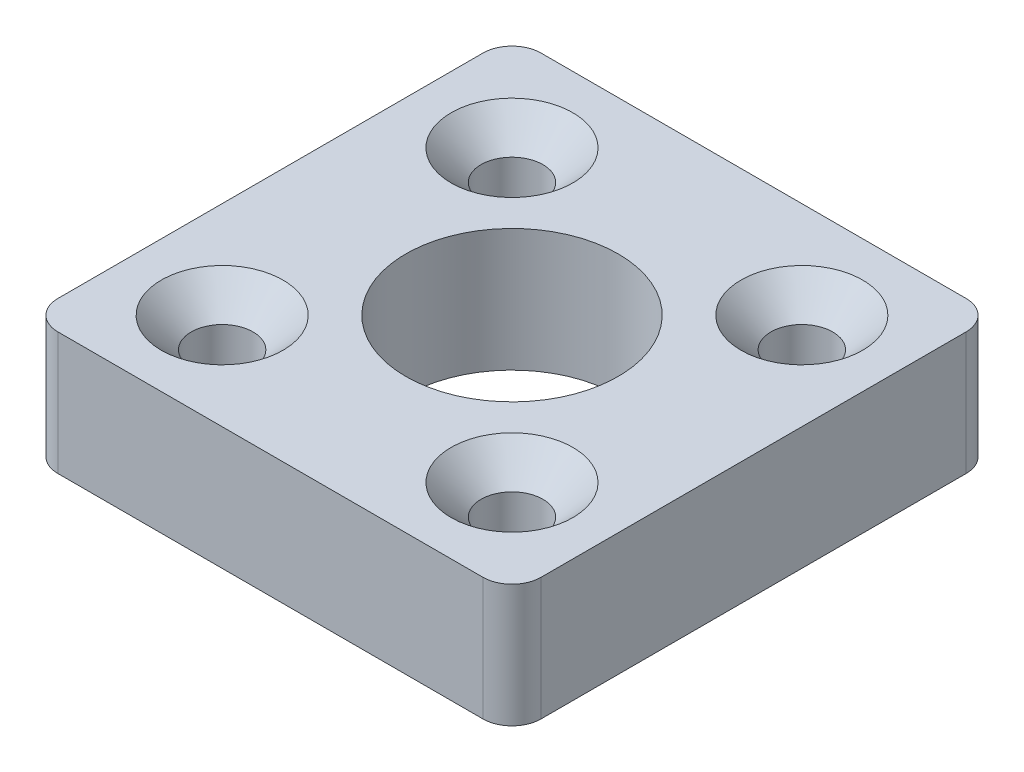
ISO-10303-21;
HEADER;
FILE_DESCRIPTION(('STEP AP214'),'2;1');
FILE_NAME('part.step','',(''),(''),'','','');
FILE_SCHEMA(('AUTOMOTIVE_DESIGN { 1 0 10303 214 1 1 1 1 }'));
ENDSEC;
DATA;
#1=APPLICATION_CONTEXT('core data for automotive mechanical design processes');
#2=APPLICATION_PROTOCOL_DEFINITION('international standard','automotive_design',2000,#1);
#3=PRODUCT_CONTEXT('',#1,'mechanical');
#4=PRODUCT('Part','Part','',(#3));
#5=PRODUCT_RELATED_PRODUCT_CATEGORY('part','',(#4));
#6=PRODUCT_DEFINITION_FORMATION('','',#4);
#7=PRODUCT_DEFINITION_CONTEXT('part definition',#1,'design');
#8=PRODUCT_DEFINITION('design','',#6,#7);
#9=PRODUCT_DEFINITION_SHAPE('','',#8);
#10=(LENGTH_UNIT() NAMED_UNIT(*) SI_UNIT(.MILLI.,.METRE.));
#11=(NAMED_UNIT(*) PLANE_ANGLE_UNIT() SI_UNIT($,.RADIAN.));
#12=(NAMED_UNIT(*) SI_UNIT($,.STERADIAN.) SOLID_ANGLE_UNIT());
#13=UNCERTAINTY_MEASURE_WITH_UNIT(LENGTH_MEASURE(1.E-05),#10,'distance_accuracy_value','');
#14=(GEOMETRIC_REPRESENTATION_CONTEXT(3) GLOBAL_UNCERTAINTY_ASSIGNED_CONTEXT((#13)) GLOBAL_UNIT_ASSIGNED_CONTEXT((#10,
#11,#12)) REPRESENTATION_CONTEXT('',''));
#15=CARTESIAN_POINT('',(0.,0.,0.));
#16=DIRECTION('',(0.,0.,1.));
#17=DIRECTION('',(1.,0.,0.));
#18=AXIS2_PLACEMENT_3D('',#15,#16,#17);
#19=CARTESIAN_POINT('',(-25.,-12.7,-25.));
#20=DIRECTION('',(-1.,0.,0.));
#21=DIRECTION('',(0.,0.,1.));
#22=AXIS2_PLACEMENT_3D('',#19,#20,#21);
#23=PLANE('',#22);
#24=DIRECTION('',(0.,0.,1.));
#25=VECTOR('',#24,1.);
#26=CARTESIAN_POINT('',(-25.,0.,-25.));
#27=LINE('',#26,#25);
#28=CARTESIAN_POINT('',(-25.,0.,-22.));
#29=VERTEX_POINT('',#28);
#30=CARTESIAN_POINT('',(-25.,0.,22.));
#31=VERTEX_POINT('',#30);
#32=EDGE_CURVE('E185',#29,#31,#27,.T.);
#33=ORIENTED_EDGE('',*,*,#32,.F.);
#34=DIRECTION('',(0.,1.,0.));
#35=VECTOR('',#34,1.);
#36=CARTESIAN_POINT('',(-25.,-12.7,-22.));
#37=LINE('',#36,#35);
#38=CARTESIAN_POINT('',(-25.,-12.7,-22.));
#39=VERTEX_POINT('',#38);
#40=EDGE_CURVE('E155',#29,#39,#37,.F.);
#41=ORIENTED_EDGE('',*,*,#40,.T.);
#42=DIRECTION('',(0.,0.,1.));
#43=VECTOR('',#42,1.);
#44=CARTESIAN_POINT('',(-25.,-12.7,-25.));
#45=LINE('',#44,#43);
#46=CARTESIAN_POINT('',(-25.,-12.7,22.));
#47=VERTEX_POINT('',#46);
#48=EDGE_CURVE('E129',#39,#47,#45,.T.);
#49=ORIENTED_EDGE('',*,*,#48,.T.);
#50=DIRECTION('',(0.,1.,0.));
#51=VECTOR('',#50,1.);
#52=CARTESIAN_POINT('',(-25.,-12.7,22.));
#53=LINE('',#52,#51);
#54=EDGE_CURVE('E151',#47,#31,#53,.T.);
#55=ORIENTED_EDGE('',*,*,#54,.T.);
#56=EDGE_LOOP('',(#33,#41,#49,#55));
#57=FACE_BOUND('',#56,.T.);
#58=ADVANCED_FACE('F39',(#57),#23,.T.);
#59=CARTESIAN_POINT('',(-25.,-12.7,-25.));
#60=DIRECTION('',(0.,0.,-1.));
#61=DIRECTION('',(-1.,0.,0.));
#62=AXIS2_PLACEMENT_3D('',#59,#60,#61);
#63=PLANE('',#62);
#64=DIRECTION('',(-1.,0.,0.));
#65=VECTOR('',#64,1.);
#66=CARTESIAN_POINT('',(-25.,-12.7,-25.));
#67=LINE('',#66,#65);
#68=CARTESIAN_POINT('',(22.,-12.7,-25.));
#69=VERTEX_POINT('',#68);
#70=CARTESIAN_POINT('',(-22.,-12.7,-25.));
#71=VERTEX_POINT('',#70);
#72=EDGE_CURVE('E135',#69,#71,#67,.T.);
#73=ORIENTED_EDGE('',*,*,#72,.T.);
#74=DIRECTION('',(0.,1.,0.));
#75=VECTOR('',#74,1.);
#76=CARTESIAN_POINT('',(-22.,-12.7,-25.));
#77=LINE('',#76,#75);
#78=CARTESIAN_POINT('',(-22.,0.,-25.));
#79=VERTEX_POINT('',#78);
#80=EDGE_CURVE('E127',#71,#79,#77,.T.);
#81=ORIENTED_EDGE('',*,*,#80,.T.);
#82=DIRECTION('',(-1.,0.,0.));
#83=VECTOR('',#82,1.);
#84=CARTESIAN_POINT('',(-25.,0.,-25.));
#85=LINE('',#84,#83);
#86=CARTESIAN_POINT('',(22.,0.,-25.));
#87=VERTEX_POINT('',#86);
#88=EDGE_CURVE('E109',#87,#79,#85,.T.);
#89=ORIENTED_EDGE('',*,*,#88,.F.);
#90=DIRECTION('',(0.,1.,0.));
#91=VECTOR('',#90,1.);
#92=CARTESIAN_POINT('',(22.,-12.7,-25.));
#93=LINE('',#92,#91);
#94=EDGE_CURVE('E124',#87,#69,#93,.F.);
#95=ORIENTED_EDGE('',*,*,#94,.T.);
#96=EDGE_LOOP('',(#73,#81,#89,#95));
#97=FACE_BOUND('',#96,.T.);
#98=ADVANCED_FACE('F123',(#97),#63,.T.);
#99=CARTESIAN_POINT('',(25.,-12.7,-25.));
#100=DIRECTION('',(1.,0.,0.));
#101=DIRECTION('',(0.,0.,-1.));
#102=AXIS2_PLACEMENT_3D('',#99,#100,#101);
#103=PLANE('',#102);
#104=DIRECTION('',(0.,0.,-1.));
#105=VECTOR('',#104,1.);
#106=CARTESIAN_POINT('',(25.,-12.7,-25.));
#107=LINE('',#106,#105);
#108=CARTESIAN_POINT('',(25.,-12.7,22.));
#109=VERTEX_POINT('',#108);
#110=CARTESIAN_POINT('',(25.,-12.7,-22.));
#111=VERTEX_POINT('',#110);
#112=EDGE_CURVE('E141',#109,#111,#107,.T.);
#113=ORIENTED_EDGE('',*,*,#112,.T.);
#114=DIRECTION('',(0.,1.,0.));
#115=VECTOR('',#114,1.);
#116=CARTESIAN_POINT('',(25.,-12.7,-22.));
#117=LINE('',#116,#115);
#118=CARTESIAN_POINT('',(25.,0.,-22.));
#119=VERTEX_POINT('',#118);
#120=EDGE_CURVE('E171',#111,#119,#117,.T.);
#121=ORIENTED_EDGE('',*,*,#120,.T.);
#122=DIRECTION('',(0.,0.,-1.));
#123=VECTOR('',#122,1.);
#124=CARTESIAN_POINT('',(25.,0.,-25.));
#125=LINE('',#124,#123);
#126=CARTESIAN_POINT('',(25.,0.,22.));
#127=VERTEX_POINT('',#126);
#128=EDGE_CURVE('E111',#127,#119,#125,.T.);
#129=ORIENTED_EDGE('',*,*,#128,.F.);
#130=DIRECTION('',(0.,1.,0.));
#131=VECTOR('',#130,1.);
#132=CARTESIAN_POINT('',(25.,-12.7,22.));
#133=LINE('',#132,#131);
#134=EDGE_CURVE('E168',#127,#109,#133,.F.);
#135=ORIENTED_EDGE('',*,*,#134,.T.);
#136=EDGE_LOOP('',(#113,#121,#129,#135));
#137=FACE_BOUND('',#136,.T.);
#138=ADVANCED_FACE('F176',(#137),#103,.T.);
#139=CARTESIAN_POINT('',(-25.,-12.7,25.));
#140=DIRECTION('',(0.,0.,1.));
#141=DIRECTION('',(1.,0.,0.));
#142=AXIS2_PLACEMENT_3D('',#139,#140,#141);
#143=PLANE('',#142);
#144=DIRECTION('',(1.,0.,0.));
#145=VECTOR('',#144,1.);
#146=CARTESIAN_POINT('',(-25.,-12.7,25.));
#147=LINE('',#146,#145);
#148=CARTESIAN_POINT('',(-22.,-12.7,25.));
#149=VERTEX_POINT('',#148);
#150=CARTESIAN_POINT('',(22.,-12.7,25.));
#151=VERTEX_POINT('',#150);
#152=EDGE_CURVE('E179',#149,#151,#147,.T.);
#153=ORIENTED_EDGE('',*,*,#152,.T.);
#154=DIRECTION('',(0.,1.,0.));
#155=VECTOR('',#154,1.);
#156=CARTESIAN_POINT('',(22.,-12.7,25.));
#157=LINE('',#156,#155);
#158=CARTESIAN_POINT('',(22.,0.,25.));
#159=VERTEX_POINT('',#158);
#160=EDGE_CURVE('E11',#151,#159,#157,.T.);
#161=ORIENTED_EDGE('',*,*,#160,.T.);
#162=DIRECTION('',(1.,0.,0.));
#163=VECTOR('',#162,1.);
#164=CARTESIAN_POINT('',(-25.,0.,25.));
#165=LINE('',#164,#163);
#166=CARTESIAN_POINT('',(-22.,0.,25.));
#167=VERTEX_POINT('',#166);
#168=EDGE_CURVE('E189',#167,#159,#165,.T.);
#169=ORIENTED_EDGE('',*,*,#168,.F.);
#170=DIRECTION('',(0.,1.,0.));
#171=VECTOR('',#170,1.);
#172=CARTESIAN_POINT('',(-22.,-12.7,25.));
#173=LINE('',#172,#171);
#174=EDGE_CURVE('E48',#167,#149,#173,.F.);
#175=ORIENTED_EDGE('',*,*,#174,.T.);
#176=EDGE_LOOP('',(#153,#161,#169,#175));
#177=FACE_BOUND('',#176,.T.);
#178=ADVANCED_FACE('F261',(#177),#143,.T.);
#179=CARTESIAN_POINT('',(0.,-12.7,0.));
#180=DIRECTION('',(0.,1.,0.));
#181=DIRECTION('',(0.,0.,1.));
#182=AXIS2_PLACEMENT_3D('',#179,#180,#181);
#183=PLANE('',#182);
#184=CARTESIAN_POINT('',(-15.,-12.7,15.));
#185=DIRECTION('',(0.,1.,0.));
#186=DIRECTION('',(0.,0.,1.));
#187=AXIS2_PLACEMENT_3D('',#184,#185,#186);
#188=CIRCLE('',#187,3.2);
#189=CARTESIAN_POINT('',(-15.,-12.7,18.2));
#190=VERTEX_POINT('',#189);
#191=EDGE_CURVE('E238',#190,#190,#188,.T.);
#192=ORIENTED_EDGE('',*,*,#191,.T.);
#193=EDGE_LOOP('',(#192));
#194=FACE_BOUND('',#193,.T.);
#195=CARTESIAN_POINT('',(15.,-12.7,15.));
#196=DIRECTION('',(0.,1.,0.));
#197=DIRECTION('',(0.,0.,1.));
#198=AXIS2_PLACEMENT_3D('',#195,#196,#197);
#199=CIRCLE('',#198,3.2);
#200=CARTESIAN_POINT('',(15.,-12.7,18.2));
#201=VERTEX_POINT('',#200);
#202=EDGE_CURVE('E226',#201,#201,#199,.T.);
#203=ORIENTED_EDGE('',*,*,#202,.T.);
#204=EDGE_LOOP('',(#203));
#205=FACE_BOUND('',#204,.T.);
#206=CARTESIAN_POINT('',(-15.,-12.7,-15.));
#207=DIRECTION('',(0.,1.,0.));
#208=DIRECTION('',(0.,0.,1.));
#209=AXIS2_PLACEMENT_3D('',#206,#207,#208);
#210=CIRCLE('',#209,3.2);
#211=CARTESIAN_POINT('',(-15.,-12.7,-11.8));
#212=VERTEX_POINT('',#211);
#213=EDGE_CURVE('E214',#212,#212,#210,.T.);
#214=ORIENTED_EDGE('',*,*,#213,.T.);
#215=EDGE_LOOP('',(#214));
#216=FACE_BOUND('',#215,.T.);
#217=CARTESIAN_POINT('',(15.,-12.7,-15.));
#218=DIRECTION('',(0.,1.,0.));
#219=DIRECTION('',(0.,0.,1.));
#220=AXIS2_PLACEMENT_3D('',#217,#218,#219);
#221=CIRCLE('',#220,3.2);
#222=CARTESIAN_POINT('',(15.,-12.7,-11.8));
#223=VERTEX_POINT('',#222);
#224=EDGE_CURVE('E202',#223,#223,#221,.T.);
#225=ORIENTED_EDGE('',*,*,#224,.T.);
#226=EDGE_LOOP('',(#225));
#227=FACE_BOUND('',#226,.T.);
#228=CARTESIAN_POINT('',(0.,-12.7,0.));
#229=DIRECTION('',(0.,1.,0.));
#230=DIRECTION('',(0.,0.,1.));
#231=AXIS2_PLACEMENT_3D('',#228,#229,#230);
#232=CIRCLE('',#231,10.993);
#233=CARTESIAN_POINT('',(0.,-12.7,10.993));
#234=VERTEX_POINT('',#233);
#235=EDGE_CURVE('E190',#234,#234,#232,.T.);
#236=ORIENTED_EDGE('',*,*,#235,.T.);
#237=EDGE_LOOP('',(#236));
#238=FACE_BOUND('',#237,.T.);
#239=ORIENTED_EDGE('',*,*,#48,.F.);
#240=CARTESIAN_POINT('',(-22.,-12.7,-22.));
#241=DIRECTION('',(0.,1.,0.));
#242=DIRECTION('',(0.,0.,1.));
#243=AXIS2_PLACEMENT_3D('',#240,#241,#242);
#244=CIRCLE('',#243,3.);
#245=EDGE_CURVE('E165',#39,#71,#244,.F.);
#246=ORIENTED_EDGE('',*,*,#245,.T.);
#247=ORIENTED_EDGE('',*,*,#72,.F.);
#248=CARTESIAN_POINT('',(22.,-12.7,-22.));
#249=DIRECTION('',(0.,1.,0.));
#250=DIRECTION('',(0.,0.,1.));
#251=AXIS2_PLACEMENT_3D('',#248,#249,#250);
#252=CIRCLE('',#251,3.);
#253=EDGE_CURVE('E133',#69,#111,#252,.F.);
#254=ORIENTED_EDGE('',*,*,#253,.T.);
#255=ORIENTED_EDGE('',*,*,#112,.F.);
#256=CARTESIAN_POINT('',(22.,-12.7,22.));
#257=DIRECTION('',(0.,1.,0.));
#258=DIRECTION('',(0.,0.,1.));
#259=AXIS2_PLACEMENT_3D('',#256,#257,#258);
#260=CIRCLE('',#259,3.);
#261=EDGE_CURVE('E55',#109,#151,#260,.F.);
#262=ORIENTED_EDGE('',*,*,#261,.T.);
#263=ORIENTED_EDGE('',*,*,#152,.F.);
#264=CARTESIAN_POINT('',(-22.,-12.7,22.));
#265=DIRECTION('',(0.,1.,0.));
#266=DIRECTION('',(0.,0.,1.));
#267=AXIS2_PLACEMENT_3D('',#264,#265,#266);
#268=CIRCLE('',#267,3.);
#269=EDGE_CURVE('E158',#149,#47,#268,.F.);
#270=ORIENTED_EDGE('',*,*,#269,.T.);
#271=EDGE_LOOP('',(#239,#246,#247,#254,#255,#262,#263,#270));
#272=FACE_BOUND('',#271,.T.);
#273=ADVANCED_FACE('F290',(#194,#205,#216,#227,#238,#272),#183,.F.);
#274=CARTESIAN_POINT('',(0.,0.,0.));
#275=DIRECTION('',(0.,1.,0.));
#276=DIRECTION('',(0.,0.,1.));
#277=AXIS2_PLACEMENT_3D('',#274,#275,#276);
#278=PLANE('',#277);
#279=CARTESIAN_POINT('',(-15.,0.,15.));
#280=DIRECTION('',(0.,1.,0.));
#281=DIRECTION('',(0.,0.,1.));
#282=AXIS2_PLACEMENT_3D('',#279,#280,#281);
#283=CIRCLE('',#282,6.3);
#284=CARTESIAN_POINT('',(-15.,0.,21.3));
#285=VERTEX_POINT('',#284);
#286=EDGE_CURVE('E246',#285,#285,#283,.T.);
#287=ORIENTED_EDGE('',*,*,#286,.F.);
#288=EDGE_LOOP('',(#287));
#289=FACE_BOUND('',#288,.T.);
#290=CARTESIAN_POINT('',(15.,0.,15.));
#291=DIRECTION('',(0.,1.,0.));
#292=DIRECTION('',(0.,0.,1.));
#293=AXIS2_PLACEMENT_3D('',#290,#291,#292);
#294=CIRCLE('',#293,6.3);
#295=CARTESIAN_POINT('',(15.,0.,21.3));
#296=VERTEX_POINT('',#295);
#297=EDGE_CURVE('E234',#296,#296,#294,.T.);
#298=ORIENTED_EDGE('',*,*,#297,.F.);
#299=EDGE_LOOP('',(#298));
#300=FACE_BOUND('',#299,.T.);
#301=CARTESIAN_POINT('',(-15.,0.,-15.));
#302=DIRECTION('',(0.,1.,0.));
#303=DIRECTION('',(0.,0.,1.));
#304=AXIS2_PLACEMENT_3D('',#301,#302,#303);
#305=CIRCLE('',#304,6.3);
#306=CARTESIAN_POINT('',(-15.,0.,-8.7));
#307=VERTEX_POINT('',#306);
#308=EDGE_CURVE('E222',#307,#307,#305,.T.);
#309=ORIENTED_EDGE('',*,*,#308,.F.);
#310=EDGE_LOOP('',(#309));
#311=FACE_BOUND('',#310,.T.);
#312=CARTESIAN_POINT('',(15.,0.,-15.));
#313=DIRECTION('',(0.,1.,0.));
#314=DIRECTION('',(0.,0.,1.));
#315=AXIS2_PLACEMENT_3D('',#312,#313,#314);
#316=CIRCLE('',#315,6.3);
#317=CARTESIAN_POINT('',(15.,0.,-8.7));
#318=VERTEX_POINT('',#317);
#319=EDGE_CURVE('E210',#318,#318,#316,.T.);
#320=ORIENTED_EDGE('',*,*,#319,.F.);
#321=EDGE_LOOP('',(#320));
#322=FACE_BOUND('',#321,.T.);
#323=CARTESIAN_POINT('',(0.,0.,0.));
#324=DIRECTION('',(0.,1.,0.));
#325=DIRECTION('',(0.,0.,1.));
#326=AXIS2_PLACEMENT_3D('',#323,#324,#325);
#327=CIRCLE('',#326,10.993);
#328=CARTESIAN_POINT('',(0.,0.,10.993));
#329=VERTEX_POINT('',#328);
#330=EDGE_CURVE('E198',#329,#329,#327,.T.);
#331=ORIENTED_EDGE('',*,*,#330,.F.);
#332=EDGE_LOOP('',(#331));
#333=FACE_BOUND('',#332,.T.);
#334=ORIENTED_EDGE('',*,*,#88,.T.);
#335=CARTESIAN_POINT('',(-22.,0.,-22.));
#336=DIRECTION('',(0.,1.,0.));
#337=DIRECTION('',(0.,0.,1.));
#338=AXIS2_PLACEMENT_3D('',#335,#336,#337);
#339=CIRCLE('',#338,3.);
#340=EDGE_CURVE('E117',#79,#29,#339,.T.);
#341=ORIENTED_EDGE('',*,*,#340,.T.);
#342=ORIENTED_EDGE('',*,*,#32,.T.);
#343=CARTESIAN_POINT('',(-22.,0.,22.));
#344=DIRECTION('',(0.,1.,0.));
#345=DIRECTION('',(0.,0.,1.));
#346=AXIS2_PLACEMENT_3D('',#343,#344,#345);
#347=CIRCLE('',#346,3.);
#348=EDGE_CURVE('E139',#31,#167,#347,.T.);
#349=ORIENTED_EDGE('',*,*,#348,.T.);
#350=ORIENTED_EDGE('',*,*,#168,.T.);
#351=CARTESIAN_POINT('',(22.,0.,22.));
#352=DIRECTION('',(0.,1.,0.));
#353=DIRECTION('',(0.,0.,1.));
#354=AXIS2_PLACEMENT_3D('',#351,#352,#353);
#355=CIRCLE('',#354,3.);
#356=EDGE_CURVE('E118',#159,#127,#355,.T.);
#357=ORIENTED_EDGE('',*,*,#356,.T.);
#358=ORIENTED_EDGE('',*,*,#128,.T.);
#359=CARTESIAN_POINT('',(22.,0.,-22.));
#360=DIRECTION('',(0.,1.,0.));
#361=DIRECTION('',(0.,0.,1.));
#362=AXIS2_PLACEMENT_3D('',#359,#360,#361);
#363=CIRCLE('',#362,3.);
#364=EDGE_CURVE('E106',#119,#87,#363,.T.);
#365=ORIENTED_EDGE('',*,*,#364,.T.);
#366=EDGE_LOOP('',(#334,#341,#342,#349,#350,#357,#358,#365));
#367=FACE_BOUND('',#366,.T.);
#368=ADVANCED_FACE('F108',(#289,#300,#311,#322,#333,#367),#278,.T.);
#369=CARTESIAN_POINT('',(0.,-12.7,0.));
#370=DIRECTION('',(0.,1.,0.));
#371=DIRECTION('',(0.,0.,1.));
#372=AXIS2_PLACEMENT_3D('',#369,#370,#371);
#373=CYLINDRICAL_SURFACE('',#372,10.993);
#374=ORIENTED_EDGE('',*,*,#235,.F.);
#375=EDGE_LOOP('',(#374));
#376=FACE_BOUND('',#375,.T.);
#377=ORIENTED_EDGE('',*,*,#330,.T.);
#378=EDGE_LOOP('',(#377));
#379=FACE_BOUND('',#378,.T.);
#380=ADVANCED_FACE('F298',(#376,#379),#373,.F.);
#381=CARTESIAN_POINT('',(15.,0.,-15.));
#382=DIRECTION('',(0.,1.,0.));
#383=DIRECTION('',(0.,0.,1.));
#384=AXIS2_PLACEMENT_3D('',#381,#382,#383);
#385=CYLINDRICAL_SURFACE('',#384,3.2);
#386=ORIENTED_EDGE('',*,*,#224,.F.);
#387=EDGE_LOOP('',(#386));
#388=FACE_BOUND('',#387,.T.);
#389=CARTESIAN_POINT('',(15.,-3.1,-15.));
#390=DIRECTION('',(0.,1.,0.));
#391=DIRECTION('',(0.,0.,1.));
#392=AXIS2_PLACEMENT_3D('',#389,#390,#391);
#393=CIRCLE('',#392,3.2);
#394=CARTESIAN_POINT('',(15.,-3.1,-11.8));
#395=VERTEX_POINT('',#394);
#396=EDGE_CURVE('E206',#395,#395,#393,.T.);
#397=ORIENTED_EDGE('',*,*,#396,.T.);
#398=EDGE_LOOP('',(#397));
#399=FACE_BOUND('',#398,.T.);
#400=ADVANCED_FACE('F405',(#388,#399),#385,.F.);
#401=CARTESIAN_POINT('',(15.,0.,-15.));
#402=DIRECTION('',(0.,1.,0.));
#403=DIRECTION('',(0.,0.,1.));
#404=AXIS2_PLACEMENT_3D('',#401,#402,#403);
#405=CONICAL_SURFACE('',#404,6.3,0.785398163397449);
#406=ORIENTED_EDGE('',*,*,#396,.F.);
#407=EDGE_LOOP('',(#406));
#408=FACE_BOUND('',#407,.T.);
#409=ORIENTED_EDGE('',*,*,#319,.T.);
#410=EDGE_LOOP('',(#409));
#411=FACE_BOUND('',#410,.T.);
#412=ADVANCED_FACE('F396',(#408,#411),#405,.F.);
#413=CARTESIAN_POINT('',(-15.,0.,-15.));
#414=DIRECTION('',(0.,1.,0.));
#415=DIRECTION('',(0.,0.,1.));
#416=AXIS2_PLACEMENT_3D('',#413,#414,#415);
#417=CYLINDRICAL_SURFACE('',#416,3.2);
#418=ORIENTED_EDGE('',*,*,#213,.F.);
#419=EDGE_LOOP('',(#418));
#420=FACE_BOUND('',#419,.T.);
#421=CARTESIAN_POINT('',(-15.,-3.1,-15.));
#422=DIRECTION('',(0.,1.,0.));
#423=DIRECTION('',(0.,0.,1.));
#424=AXIS2_PLACEMENT_3D('',#421,#422,#423);
#425=CIRCLE('',#424,3.2);
#426=CARTESIAN_POINT('',(-15.,-3.1,-11.8));
#427=VERTEX_POINT('',#426);
#428=EDGE_CURVE('E218',#427,#427,#425,.T.);
#429=ORIENTED_EDGE('',*,*,#428,.T.);
#430=EDGE_LOOP('',(#429));
#431=FACE_BOUND('',#430,.T.);
#432=ADVANCED_FACE('F387',(#420,#431),#417,.F.);
#433=CARTESIAN_POINT('',(-15.,0.,-15.));
#434=DIRECTION('',(0.,1.,0.));
#435=DIRECTION('',(0.,0.,1.));
#436=AXIS2_PLACEMENT_3D('',#433,#434,#435);
#437=CONICAL_SURFACE('',#436,6.3,0.785398163397449);
#438=ORIENTED_EDGE('',*,*,#428,.F.);
#439=EDGE_LOOP('',(#438));
#440=FACE_BOUND('',#439,.T.);
#441=ORIENTED_EDGE('',*,*,#308,.T.);
#442=EDGE_LOOP('',(#441));
#443=FACE_BOUND('',#442,.T.);
#444=ADVANCED_FACE('F378',(#440,#443),#437,.F.);
#445=CARTESIAN_POINT('',(15.,0.,15.));
#446=DIRECTION('',(0.,1.,0.));
#447=DIRECTION('',(0.,0.,1.));
#448=AXIS2_PLACEMENT_3D('',#445,#446,#447);
#449=CYLINDRICAL_SURFACE('',#448,3.2);
#450=ORIENTED_EDGE('',*,*,#202,.F.);
#451=EDGE_LOOP('',(#450));
#452=FACE_BOUND('',#451,.T.);
#453=CARTESIAN_POINT('',(15.,-3.1,15.));
#454=DIRECTION('',(0.,1.,0.));
#455=DIRECTION('',(0.,0.,1.));
#456=AXIS2_PLACEMENT_3D('',#453,#454,#455);
#457=CIRCLE('',#456,3.2);
#458=CARTESIAN_POINT('',(15.,-3.1,18.2));
#459=VERTEX_POINT('',#458);
#460=EDGE_CURVE('E230',#459,#459,#457,.T.);
#461=ORIENTED_EDGE('',*,*,#460,.T.);
#462=EDGE_LOOP('',(#461));
#463=FACE_BOUND('',#462,.T.);
#464=ADVANCED_FACE('F369',(#452,#463),#449,.F.);
#465=CARTESIAN_POINT('',(15.,0.,15.));
#466=DIRECTION('',(0.,1.,0.));
#467=DIRECTION('',(0.,0.,1.));
#468=AXIS2_PLACEMENT_3D('',#465,#466,#467);
#469=CONICAL_SURFACE('',#468,6.3,0.785398163397449);
#470=ORIENTED_EDGE('',*,*,#460,.F.);
#471=EDGE_LOOP('',(#470));
#472=FACE_BOUND('',#471,.T.);
#473=ORIENTED_EDGE('',*,*,#297,.T.);
#474=EDGE_LOOP('',(#473));
#475=FACE_BOUND('',#474,.T.);
#476=ADVANCED_FACE('F360',(#472,#475),#469,.F.);
#477=CARTESIAN_POINT('',(-15.,0.,15.));
#478=DIRECTION('',(0.,1.,0.));
#479=DIRECTION('',(0.,0.,1.));
#480=AXIS2_PLACEMENT_3D('',#477,#478,#479);
#481=CYLINDRICAL_SURFACE('',#480,3.2);
#482=ORIENTED_EDGE('',*,*,#191,.F.);
#483=EDGE_LOOP('',(#482));
#484=FACE_BOUND('',#483,.T.);
#485=CARTESIAN_POINT('',(-15.,-3.1,15.));
#486=DIRECTION('',(0.,1.,0.));
#487=DIRECTION('',(0.,0.,1.));
#488=AXIS2_PLACEMENT_3D('',#485,#486,#487);
#489=CIRCLE('',#488,3.2);
#490=CARTESIAN_POINT('',(-15.,-3.1,18.2));
#491=VERTEX_POINT('',#490);
#492=EDGE_CURVE('E242',#491,#491,#489,.T.);
#493=ORIENTED_EDGE('',*,*,#492,.T.);
#494=EDGE_LOOP('',(#493));
#495=FACE_BOUND('',#494,.T.);
#496=ADVANCED_FACE('F287',(#484,#495),#481,.F.);
#497=CARTESIAN_POINT('',(-15.,0.,15.));
#498=DIRECTION('',(0.,1.,0.));
#499=DIRECTION('',(0.,0.,1.));
#500=AXIS2_PLACEMENT_3D('',#497,#498,#499);
#501=CONICAL_SURFACE('',#500,6.3,0.785398163397449);
#502=ORIENTED_EDGE('',*,*,#492,.F.);
#503=EDGE_LOOP('',(#502));
#504=FACE_BOUND('',#503,.T.);
#505=ORIENTED_EDGE('',*,*,#286,.T.);
#506=EDGE_LOOP('',(#505));
#507=FACE_BOUND('',#506,.T.);
#508=ADVANCED_FACE('F282',(#504,#507),#501,.F.);
#509=CARTESIAN_POINT('',(-22.,-12.7,-22.));
#510=DIRECTION('',(0.,1.,0.));
#511=DIRECTION('',(0.,0.,1.));
#512=AXIS2_PLACEMENT_3D('',#509,#510,#511);
#513=CYLINDRICAL_SURFACE('',#512,3.);
#514=ORIENTED_EDGE('',*,*,#245,.F.);
#515=ORIENTED_EDGE('',*,*,#40,.F.);
#516=ORIENTED_EDGE('',*,*,#340,.F.);
#517=ORIENTED_EDGE('',*,*,#80,.F.);
#518=EDGE_LOOP('',(#514,#515,#516,#517));
#519=FACE_BOUND('',#518,.T.);
#520=ADVANCED_FACE('F270',(#519),#513,.T.);
#521=CARTESIAN_POINT('',(22.,-12.7,-22.));
#522=DIRECTION('',(0.,1.,0.));
#523=DIRECTION('',(0.,0.,1.));
#524=AXIS2_PLACEMENT_3D('',#521,#522,#523);
#525=CYLINDRICAL_SURFACE('',#524,3.);
#526=ORIENTED_EDGE('',*,*,#253,.F.);
#527=ORIENTED_EDGE('',*,*,#94,.F.);
#528=ORIENTED_EDGE('',*,*,#364,.F.);
#529=ORIENTED_EDGE('',*,*,#120,.F.);
#530=EDGE_LOOP('',(#526,#527,#528,#529));
#531=FACE_BOUND('',#530,.T.);
#532=ADVANCED_FACE('F132',(#531),#525,.T.);
#533=CARTESIAN_POINT('',(22.,-12.7,22.));
#534=DIRECTION('',(0.,1.,0.));
#535=DIRECTION('',(0.,0.,1.));
#536=AXIS2_PLACEMENT_3D('',#533,#534,#535);
#537=CYLINDRICAL_SURFACE('',#536,3.);
#538=ORIENTED_EDGE('',*,*,#261,.F.);
#539=ORIENTED_EDGE('',*,*,#134,.F.);
#540=ORIENTED_EDGE('',*,*,#356,.F.);
#541=ORIENTED_EDGE('',*,*,#160,.F.);
#542=EDGE_LOOP('',(#538,#539,#540,#541));
#543=FACE_BOUND('',#542,.T.);
#544=ADVANCED_FACE('F264',(#543),#537,.T.);
#545=CARTESIAN_POINT('',(-22.,-12.7,22.));
#546=DIRECTION('',(0.,1.,0.));
#547=DIRECTION('',(0.,0.,1.));
#548=AXIS2_PLACEMENT_3D('',#545,#546,#547);
#549=CYLINDRICAL_SURFACE('',#548,3.);
#550=ORIENTED_EDGE('',*,*,#269,.F.);
#551=ORIENTED_EDGE('',*,*,#174,.F.);
#552=ORIENTED_EDGE('',*,*,#348,.F.);
#553=ORIENTED_EDGE('',*,*,#54,.F.);
#554=EDGE_LOOP('',(#550,#551,#552,#553));
#555=FACE_BOUND('',#554,.T.);
#556=ADVANCED_FACE('F41',(#555),#549,.T.);
#557=CLOSED_SHELL('',(#58,#98,#138,#178,#273,#368,#380,#400,#412,#432,#444,#464,#476,#496,#508,
#520,#532,#544,#556));
#558=MANIFOLD_SOLID_BREP('B2',#557);
#559=ADVANCED_BREP_SHAPE_REPRESENTATION('',(#18,#558),#14);
#560=SHAPE_DEFINITION_REPRESENTATION(#9,#559);
ENDSEC;
END-ISO-10303-21;
